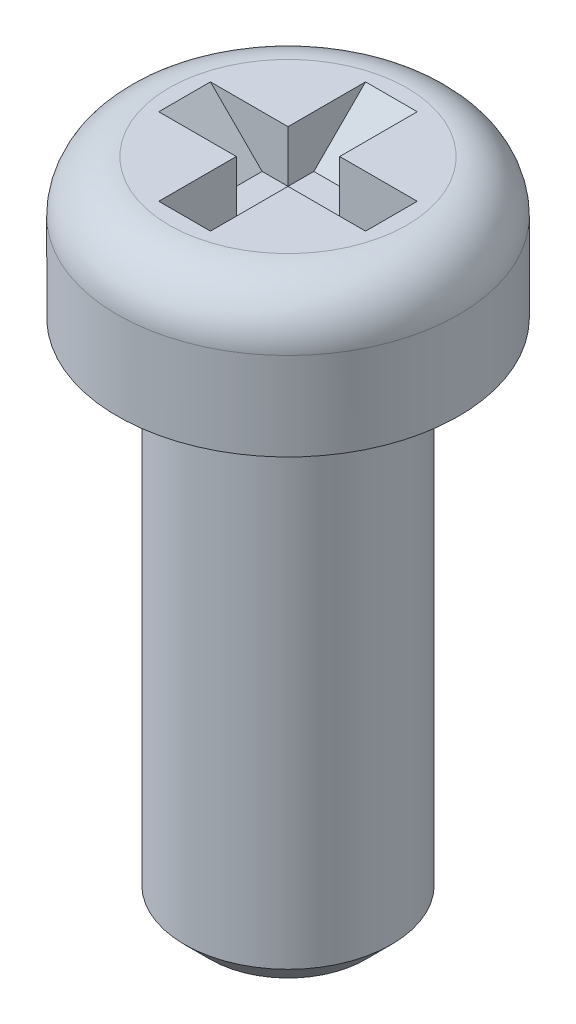
ISO-10303-21;
HEADER;
FILE_DESCRIPTION(('STEP AP214'),'2;1');
FILE_NAME('part.step','',(''),(''),'','','');
FILE_SCHEMA(('AUTOMOTIVE_DESIGN { 1 0 10303 214 1 1 1 1 }'));
ENDSEC;
DATA;
#1=APPLICATION_CONTEXT('core data for automotive mechanical design processes');
#2=APPLICATION_PROTOCOL_DEFINITION('international standard','automotive_design',2000,#1);
#3=PRODUCT_CONTEXT('',#1,'mechanical');
#4=PRODUCT('Part','Part','',(#3));
#5=PRODUCT_RELATED_PRODUCT_CATEGORY('part','',(#4));
#6=PRODUCT_DEFINITION_FORMATION('','',#4);
#7=PRODUCT_DEFINITION_CONTEXT('part definition',#1,'design');
#8=PRODUCT_DEFINITION('design','',#6,#7);
#9=PRODUCT_DEFINITION_SHAPE('','',#8);
#10=(LENGTH_UNIT() NAMED_UNIT(*) SI_UNIT(.MILLI.,.METRE.));
#11=(NAMED_UNIT(*) PLANE_ANGLE_UNIT() SI_UNIT($,.RADIAN.));
#12=(NAMED_UNIT(*) SI_UNIT($,.STERADIAN.) SOLID_ANGLE_UNIT());
#13=UNCERTAINTY_MEASURE_WITH_UNIT(LENGTH_MEASURE(1.E-05),#10,'distance_accuracy_value','');
#14=(GEOMETRIC_REPRESENTATION_CONTEXT(3) GLOBAL_UNCERTAINTY_ASSIGNED_CONTEXT((#13)) GLOBAL_UNIT_ASSIGNED_CONTEXT((#10,
#11,#12)) REPRESENTATION_CONTEXT('',''));
#15=CARTESIAN_POINT('',(0.,0.,0.));
#16=DIRECTION('',(0.,0.,1.));
#17=DIRECTION('',(1.,0.,0.));
#18=AXIS2_PLACEMENT_3D('',#15,#16,#17);
#19=CARTESIAN_POINT('',(0.,10.,0.));
#20=DIRECTION('',(0.,-1.,0.));
#21=DIRECTION('',(0.,0.,-1.));
#22=AXIS2_PLACEMENT_3D('',#19,#20,#21);
#23=CYLINDRICAL_SURFACE('',#22,2.);
#24=CARTESIAN_POINT('',(0.,0.5,0.));
#25=DIRECTION('',(0.,1.,0.));
#26=DIRECTION('',(0.,0.,1.));
#27=AXIS2_PLACEMENT_3D('',#24,#25,#26);
#28=CIRCLE('',#27,2.);
#29=CARTESIAN_POINT('',(0.,0.5,2.));
#30=VERTEX_POINT('',#29);
#31=EDGE_CURVE('E245',#30,#30,#28,.T.);
#32=ORIENTED_EDGE('',*,*,#31,.T.);
#33=EDGE_LOOP('',(#32));
#34=FACE_BOUND('',#33,.T.);
#35=CARTESIAN_POINT('',(0.,10.,0.));
#36=DIRECTION('',(0.,1.,0.));
#37=DIRECTION('',(0.,0.,1.));
#38=AXIS2_PLACEMENT_3D('',#35,#36,#37);
#39=CIRCLE('',#38,2.);
#40=CARTESIAN_POINT('',(0.,10.,2.));
#41=VERTEX_POINT('',#40);
#42=EDGE_CURVE('E231',#41,#41,#39,.T.);
#43=ORIENTED_EDGE('',*,*,#42,.F.);
#44=EDGE_LOOP('',(#43));
#45=FACE_BOUND('',#44,.T.);
#46=ADVANCED_FACE('F70',(#34,#45),#23,.T.);
#47=CARTESIAN_POINT('',(0.,0.,0.));
#48=DIRECTION('',(0.,1.,0.));
#49=DIRECTION('',(0.,0.,1.));
#50=AXIS2_PLACEMENT_3D('',#47,#48,#49);
#51=PLANE('',#50);
#52=CARTESIAN_POINT('',(0.,0.,0.));
#53=DIRECTION('',(0.,1.,0.));
#54=DIRECTION('',(0.,0.,1.));
#55=AXIS2_PLACEMENT_3D('',#52,#53,#54);
#56=CIRCLE('',#55,1.5);
#57=CARTESIAN_POINT('',(0.,0.,1.5));
#58=VERTEX_POINT('',#57);
#59=EDGE_CURVE('E244',#58,#58,#56,.F.);
#60=ORIENTED_EDGE('',*,*,#59,.T.);
#61=EDGE_LOOP('',(#60));
#62=FACE_BOUND('',#61,.T.);
#63=ADVANCED_FACE('F309',(#62),#51,.F.);
#64=CARTESIAN_POINT('',(0.,12.7,0.));
#65=DIRECTION('',(0.,-1.,0.));
#66=DIRECTION('',(0.,0.,-1.));
#67=AXIS2_PLACEMENT_3D('',#64,#65,#66);
#68=CYLINDRICAL_SURFACE('',#67,3.3);
#69=CARTESIAN_POINT('',(0.,11.7,0.));
#70=DIRECTION('',(0.,1.,0.));
#71=DIRECTION('',(0.,0.,1.));
#72=AXIS2_PLACEMENT_3D('',#69,#70,#71);
#73=CIRCLE('',#72,3.3);
#74=CARTESIAN_POINT('',(0.,11.7,-3.3));
#75=VERTEX_POINT('',#74);
#76=EDGE_CURVE('E237',#75,#75,#73,.F.);
#77=CARTESIAN_POINT('',(0.,10.,0.));
#78=DIRECTION('',(0.,1.,0.));
#79=DIRECTION('',(0.,0.,1.));
#80=AXIS2_PLACEMENT_3D('',#77,#78,#79);
#81=CIRCLE('',#80,3.3);
#82=CARTESIAN_POINT('',(0.,10.,-3.3));
#83=VERTEX_POINT('',#82);
#84=EDGE_CURVE('E217',#83,#83,#81,.T.);
#85=CARTESIAN_POINT('',(0.,11.7,-3.3));
#86=CARTESIAN_POINT('',(0.,11.6822916666667,-3.3));
#87=CARTESIAN_POINT('',(0.,11.6645833333333,-3.3));
#88=CARTESIAN_POINT('',(0.,11.6291666666667,-3.3));
#89=CARTESIAN_POINT('',(0.,11.6114583333333,-3.3));
#90=CARTESIAN_POINT('',(0.,11.5760416666667,-3.3));
#91=CARTESIAN_POINT('',(0.,11.5583333333333,-3.3));
#92=CARTESIAN_POINT('',(0.,11.5229166666667,-3.3));
#93=CARTESIAN_POINT('',(0.,11.5052083333333,-3.3));
#94=CARTESIAN_POINT('',(0.,11.4697916666667,-3.3));
#95=CARTESIAN_POINT('',(0.,11.4520833333333,-3.3));
#96=CARTESIAN_POINT('',(0.,11.4166666666667,-3.3));
#97=CARTESIAN_POINT('',(0.,11.3989583333333,-3.3));
#98=CARTESIAN_POINT('',(0.,11.3635416666667,-3.3));
#99=CARTESIAN_POINT('',(0.,11.3458333333333,-3.3));
#100=CARTESIAN_POINT('',(0.,11.3104166666667,-3.3));
#101=CARTESIAN_POINT('',(0.,11.2927083333333,-3.3));
#102=CARTESIAN_POINT('',(0.,11.2572916666667,-3.3));
#103=CARTESIAN_POINT('',(0.,11.2395833333333,-3.3));
#104=CARTESIAN_POINT('',(0.,11.2041666666667,-3.3));
#105=CARTESIAN_POINT('',(0.,11.1864583333333,-3.3));
#106=CARTESIAN_POINT('',(0.,11.1510416666667,-3.3));
#107=CARTESIAN_POINT('',(0.,11.1333333333333,-3.3));
#108=CARTESIAN_POINT('',(0.,11.0979166666667,-3.3));
#109=CARTESIAN_POINT('',(0.,11.0802083333333,-3.3));
#110=CARTESIAN_POINT('',(0.,11.0447916666667,-3.3));
#111=CARTESIAN_POINT('',(0.,11.0270833333333,-3.3));
#112=CARTESIAN_POINT('',(0.,10.9916666666667,-3.3));
#113=CARTESIAN_POINT('',(0.,10.9739583333333,-3.3));
#114=CARTESIAN_POINT('',(0.,10.9385416666667,-3.3));
#115=CARTESIAN_POINT('',(0.,10.9208333333333,-3.3));
#116=CARTESIAN_POINT('',(0.,10.8854166666667,-3.3));
#117=CARTESIAN_POINT('',(0.,10.8677083333333,-3.3));
#118=CARTESIAN_POINT('',(0.,10.8322916666667,-3.3));
#119=CARTESIAN_POINT('',(0.,10.8145833333333,-3.3));
#120=CARTESIAN_POINT('',(0.,10.7791666666667,-3.3));
#121=CARTESIAN_POINT('',(0.,10.7614583333333,-3.3));
#122=CARTESIAN_POINT('',(0.,10.7260416666667,-3.3));
#123=CARTESIAN_POINT('',(0.,10.7083333333333,-3.3));
#124=CARTESIAN_POINT('',(0.,10.6729166666667,-3.3));
#125=CARTESIAN_POINT('',(0.,10.6552083333333,-3.3));
#126=CARTESIAN_POINT('',(0.,10.6197916666667,-3.3));
#127=CARTESIAN_POINT('',(0.,10.6020833333333,-3.3));
#128=CARTESIAN_POINT('',(0.,10.5666666666667,-3.3));
#129=CARTESIAN_POINT('',(0.,10.5489583333333,-3.3));
#130=CARTESIAN_POINT('',(0.,10.5135416666667,-3.3));
#131=CARTESIAN_POINT('',(0.,10.4958333333333,-3.3));
#132=CARTESIAN_POINT('',(0.,10.4604166666667,-3.3));
#133=CARTESIAN_POINT('',(0.,10.4427083333333,-3.3));
#134=CARTESIAN_POINT('',(0.,10.4072916666667,-3.3));
#135=CARTESIAN_POINT('',(0.,10.3895833333333,-3.3));
#136=CARTESIAN_POINT('',(0.,10.3541666666667,-3.3));
#137=CARTESIAN_POINT('',(0.,10.3364583333333,-3.3));
#138=CARTESIAN_POINT('',(0.,10.3010416666667,-3.3));
#139=CARTESIAN_POINT('',(0.,10.2833333333333,-3.3));
#140=CARTESIAN_POINT('',(0.,10.2479166666667,-3.3));
#141=CARTESIAN_POINT('',(0.,10.2302083333333,-3.3));
#142=CARTESIAN_POINT('',(0.,10.1947916666667,-3.3));
#143=CARTESIAN_POINT('',(0.,10.1770833333333,-3.3));
#144=CARTESIAN_POINT('',(0.,10.1416666666667,-3.3));
#145=CARTESIAN_POINT('',(0.,10.1239583333333,-3.3));
#146=CARTESIAN_POINT('',(0.,10.0885416666667,-3.3));
#147=CARTESIAN_POINT('',(0.,10.0708333333333,-3.3));
#148=CARTESIAN_POINT('',(0.,10.0354166666667,-3.3));
#149=CARTESIAN_POINT('',(0.,10.0177083333333,-3.3));
#150=CARTESIAN_POINT('',(0.,10.,-3.3));
#151=B_SPLINE_CURVE_WITH_KNOTS('',3,(#85,#86,#87,#88,#89,#90,#91,#92,#93,#94,#95,#96,#97,#98,
#99,#100,#101,#102,#103,#104,#105,#106,#107,#108,#109,#110,#111,#112,#113,#114,#115,#116,#117,
#118,#119,#120,#121,#122,#123,#124,#125,#126,#127,#128,#129,#130,#131,#132,#133,#134,#135,#136,
#137,#138,#139,#140,#141,#142,#143,#144,#145,#146,#147,#148,#149,#150),.UNSPECIFIED.,.F.,.F.,(4,
2,2,2,2,2,2,2,2,2,2,2,2,2,2,2,2,2,2,2,2,2,2,2,2,2,2,2,2,2,2,2,4),(0.,0.0531249999999994,
0.106249999999999,0.159375,0.212499999999999,0.265624999999999,0.31875,0.371874999999999,
0.424999999999998,0.478124999999999,0.531249999999999,0.584374999999998,0.637499999999999,
0.690624999999998,0.743749999999998,0.796874999999999,0.849999999999998,0.903124999999998,
0.956249999999997,1.009375,1.0625,1.115625,1.16875,1.221875,1.275,1.328125,1.38125,1.434375,
1.4875,1.540625,1.59375,1.646875,1.7),.UNSPECIFIED.);
#152=EDGE_CURVE('BSEAM317',#75,#83,#151,.T.);
#153=ORIENTED_EDGE('',*,*,#76,.T.);
#154=ORIENTED_EDGE('',*,*,#84,.T.);
#155=ORIENTED_EDGE('',*,*,#152,.T.);
#156=ORIENTED_EDGE('',*,*,#152,.F.);
#157=EDGE_LOOP('',(#153,#155,#154,#156));
#158=FACE_BOUND('',#157,.T.);
#159=ADVANCED_FACE('F317',(#158),#68,.T.);
#160=CARTESIAN_POINT('',(0.,12.7,0.));
#161=DIRECTION('',(0.,1.,0.));
#162=DIRECTION('',(0.,0.,1.));
#163=AXIS2_PLACEMENT_3D('',#160,#161,#162);
#164=PLANE('',#163);
#165=DIRECTION('',(0.,0.,-1.));
#166=VECTOR('',#165,1.);
#167=CARTESIAN_POINT('',(-0.5,12.7,-2.));
#168=LINE('',#167,#166);
#169=CARTESIAN_POINT('',(-0.5,12.7,-2.));
#170=VERTEX_POINT('',#169);
#171=CARTESIAN_POINT('',(-0.5,12.7,-0.5));
#172=VERTEX_POINT('',#171);
#173=EDGE_CURVE('E190',#170,#172,#168,.F.);
#174=ORIENTED_EDGE('',*,*,#173,.F.);
#175=DIRECTION('',(1.,0.,0.));
#176=VECTOR('',#175,1.);
#177=CARTESIAN_POINT('',(-0.5,12.7,-2.));
#178=LINE('',#177,#176);
#179=CARTESIAN_POINT('',(0.5,12.7,-2.));
#180=VERTEX_POINT('',#179);
#181=EDGE_CURVE('E193',#170,#180,#178,.T.);
#182=ORIENTED_EDGE('',*,*,#181,.T.);
#183=DIRECTION('',(0.,0.,-1.));
#184=VECTOR('',#183,1.);
#185=CARTESIAN_POINT('',(0.5,12.7,-2.));
#186=LINE('',#185,#184);
#187=CARTESIAN_POINT('',(0.5,12.7,-0.5));
#188=VERTEX_POINT('',#187);
#189=EDGE_CURVE('E185',#180,#188,#186,.F.);
#190=ORIENTED_EDGE('',*,*,#189,.T.);
#191=DIRECTION('',(1.,0.,0.));
#192=VECTOR('',#191,1.);
#193=CARTESIAN_POINT('',(-2.,12.7,-0.5));
#194=LINE('',#193,#192);
#195=CARTESIAN_POINT('',(2.,12.7,-0.500000000000001));
#196=VERTEX_POINT('',#195);
#197=EDGE_CURVE('E221',#188,#196,#194,.T.);
#198=ORIENTED_EDGE('',*,*,#197,.T.);
#199=DIRECTION('',(0.,0.,1.));
#200=VECTOR('',#199,1.);
#201=CARTESIAN_POINT('',(2.,12.7,-0.500000000000001));
#202=LINE('',#201,#200);
#203=CARTESIAN_POINT('',(2.,12.7,0.499999999999999));
#204=VERTEX_POINT('',#203);
#205=EDGE_CURVE('E225',#196,#204,#202,.T.);
#206=ORIENTED_EDGE('',*,*,#205,.T.);
#207=DIRECTION('',(1.,0.,0.));
#208=VECTOR('',#207,1.);
#209=CARTESIAN_POINT('',(-2.,12.7,0.5));
#210=LINE('',#209,#208);
#211=CARTESIAN_POINT('',(0.5,12.7,0.5));
#212=VERTEX_POINT('',#211);
#213=EDGE_CURVE('E181',#212,#204,#210,.T.);
#214=ORIENTED_EDGE('',*,*,#213,.F.);
#215=CARTESIAN_POINT('',(0.5,12.7,2.));
#216=VERTEX_POINT('',#215);
#217=EDGE_CURVE('E162',#212,#216,#186,.F.);
#218=ORIENTED_EDGE('',*,*,#217,.T.);
#219=DIRECTION('',(-1.,0.,0.));
#220=VECTOR('',#219,1.);
#221=CARTESIAN_POINT('',(0.5,12.7,2.));
#222=LINE('',#221,#220);
#223=CARTESIAN_POINT('',(-0.5,12.7,2.));
#224=VERTEX_POINT('',#223);
#225=EDGE_CURVE('E178',#216,#224,#222,.T.);
#226=ORIENTED_EDGE('',*,*,#225,.T.);
#227=CARTESIAN_POINT('',(-0.5,12.7,0.5));
#228=VERTEX_POINT('',#227);
#229=EDGE_CURVE('E188',#228,#224,#168,.F.);
#230=ORIENTED_EDGE('',*,*,#229,.F.);
#231=CARTESIAN_POINT('',(-2.,12.7,0.5));
#232=VERTEX_POINT('',#231);
#233=EDGE_CURVE('E220',#232,#228,#210,.T.);
#234=ORIENTED_EDGE('',*,*,#233,.F.);
#235=DIRECTION('',(0.,0.,-1.));
#236=VECTOR('',#235,1.);
#237=CARTESIAN_POINT('',(-2.,12.7,0.5));
#238=LINE('',#237,#236);
#239=CARTESIAN_POINT('',(-2.,12.7,-0.5));
#240=VERTEX_POINT('',#239);
#241=EDGE_CURVE('E226',#232,#240,#238,.T.);
#242=ORIENTED_EDGE('',*,*,#241,.T.);
#243=EDGE_CURVE('E223',#240,#172,#194,.T.);
#244=ORIENTED_EDGE('',*,*,#243,.T.);
#245=EDGE_LOOP('',(#174,#182,#190,#198,#206,#214,#218,#226,#230,#234,#242,#244));
#246=FACE_BOUND('',#245,.T.);
#247=CARTESIAN_POINT('',(0.,12.7,0.));
#248=DIRECTION('',(0.,1.,0.));
#249=DIRECTION('',(0.,0.,1.));
#250=AXIS2_PLACEMENT_3D('',#247,#248,#249);
#251=CIRCLE('',#250,2.3);
#252=CARTESIAN_POINT('',(0.,12.7,2.3));
#253=VERTEX_POINT('',#252);
#254=EDGE_CURVE('E236',#253,#253,#251,.T.);
#255=ORIENTED_EDGE('',*,*,#254,.T.);
#256=EDGE_LOOP('',(#255));
#257=FACE_BOUND('',#256,.T.);
#258=ADVANCED_FACE('F174',(#246,#257),#164,.T.);
#259=CARTESIAN_POINT('',(0.,10.,0.));
#260=DIRECTION('',(0.,1.,0.));
#261=DIRECTION('',(0.,0.,1.));
#262=AXIS2_PLACEMENT_3D('',#259,#260,#261);
#263=PLANE('',#262);
#264=ORIENTED_EDGE('',*,*,#42,.T.);
#265=EDGE_LOOP('',(#264));
#266=FACE_BOUND('',#265,.T.);
#267=ORIENTED_EDGE('',*,*,#84,.F.);
#268=EDGE_LOOP('',(#267));
#269=FACE_BOUND('',#268,.T.);
#270=ADVANCED_FACE('F324',(#266,#269),#263,.F.);
#271=CARTESIAN_POINT('',(0.,11.7,0.));
#272=DIRECTION('',(0.,1.,0.));
#273=DIRECTION('',(0.,0.,1.));
#274=AXIS2_PLACEMENT_3D('',#271,#272,#273);
#275=TOROIDAL_SURFACE('',#274,2.3,1.);
#276=ORIENTED_EDGE('',*,*,#76,.F.);
#277=EDGE_LOOP('',(#276));
#278=FACE_BOUND('',#277,.T.);
#279=ORIENTED_EDGE('',*,*,#254,.F.);
#280=EDGE_LOOP('',(#279));
#281=FACE_BOUND('',#280,.T.);
#282=ADVANCED_FACE('F302',(#278,#281),#275,.T.);
#283=CARTESIAN_POINT('',(0.,0.5,0.));
#284=DIRECTION('',(0.,1.,0.));
#285=DIRECTION('',(0.,0.,1.));
#286=AXIS2_PLACEMENT_3D('',#283,#284,#285);
#287=CONICAL_SURFACE('',#286,2.,0.78539816339745);
#288=ORIENTED_EDGE('',*,*,#59,.F.);
#289=EDGE_LOOP('',(#288));
#290=FACE_BOUND('',#289,.T.);
#291=ORIENTED_EDGE('',*,*,#31,.F.);
#292=EDGE_LOOP('',(#291));
#293=FACE_BOUND('',#292,.T.);
#294=ADVANCED_FACE('F298',(#290,#293),#287,.T.);
#295=CARTESIAN_POINT('',(-2.,11.7,0.5));
#296=DIRECTION('',(0.,0.,1.));
#297=DIRECTION('',(1.,0.,0.));
#298=AXIS2_PLACEMENT_3D('',#295,#296,#297);
#299=PLANE('',#298);
#300=ORIENTED_EDGE('',*,*,#213,.T.);
#301=DIRECTION('',(-0.707106781186544,-0.707106781186551,0.));
#302=VECTOR('',#301,1.);
#303=CARTESIAN_POINT('',(2.,12.7,0.499999999999999));
#304=LINE('',#303,#302);
#305=CARTESIAN_POINT('',(1.,11.7,0.5));
#306=VERTEX_POINT('',#305);
#307=EDGE_CURVE('E166',#204,#306,#304,.T.);
#308=ORIENTED_EDGE('',*,*,#307,.T.);
#309=DIRECTION('',(1.,0.,0.));
#310=VECTOR('',#309,1.);
#311=CARTESIAN_POINT('',(-2.,11.7,0.5));
#312=LINE('',#311,#310);
#313=CARTESIAN_POINT('',(0.5,11.7,0.5));
#314=VERTEX_POINT('',#313);
#315=EDGE_CURVE('E211',#314,#306,#312,.T.);
#316=ORIENTED_EDGE('',*,*,#315,.F.);
#317=DIRECTION('',(0.,-1.,0.));
#318=VECTOR('',#317,1.);
#319=CARTESIAN_POINT('',(0.5,11.7,0.5));
#320=LINE('',#319,#318);
#321=EDGE_CURVE('E205',#212,#314,#320,.T.);
#322=ORIENTED_EDGE('',*,*,#321,.F.);
#323=EDGE_LOOP('',(#300,#308,#316,#322));
#324=FACE_BOUND('',#323,.T.);
#325=ADVANCED_FACE('F295',(#324),#299,.F.);
#326=CARTESIAN_POINT('',(-2.,11.7,-0.5));
#327=DIRECTION('',(0.,0.,1.));
#328=DIRECTION('',(1.,0.,0.));
#329=AXIS2_PLACEMENT_3D('',#326,#327,#328);
#330=PLANE('',#329);
#331=DIRECTION('',(1.,0.,0.));
#332=VECTOR('',#331,1.);
#333=CARTESIAN_POINT('',(-2.,11.7,-0.5));
#334=LINE('',#333,#332);
#335=CARTESIAN_POINT('',(0.5,11.7,-0.5));
#336=VERTEX_POINT('',#335);
#337=CARTESIAN_POINT('',(1.,11.7,-0.5));
#338=VERTEX_POINT('',#337);
#339=EDGE_CURVE('E214',#336,#338,#334,.T.);
#340=ORIENTED_EDGE('',*,*,#339,.T.);
#341=DIRECTION('',(0.707106781186544,0.707106781186551,0.));
#342=VECTOR('',#341,1.);
#343=CARTESIAN_POINT('',(-0.499999999999984,10.2,-0.5));
#344=LINE('',#343,#342);
#345=EDGE_CURVE('E257',#338,#196,#344,.T.);
#346=ORIENTED_EDGE('',*,*,#345,.T.);
#347=ORIENTED_EDGE('',*,*,#197,.F.);
#348=DIRECTION('',(0.,-1.,0.));
#349=VECTOR('',#348,1.);
#350=CARTESIAN_POINT('',(0.5,11.7,-0.5));
#351=LINE('',#350,#349);
#352=EDGE_CURVE('E200',#188,#336,#351,.T.);
#353=ORIENTED_EDGE('',*,*,#352,.T.);
#354=EDGE_LOOP('',(#340,#346,#347,#353));
#355=FACE_BOUND('',#354,.T.);
#356=ADVANCED_FACE('F290',(#355),#330,.T.);
#357=CARTESIAN_POINT('',(-1.,11.7,0.5));
#358=VERTEX_POINT('',#357);
#359=CARTESIAN_POINT('',(-0.5,11.7,0.5));
#360=VERTEX_POINT('',#359);
#361=EDGE_CURVE('E212',#358,#360,#312,.T.);
#362=ORIENTED_EDGE('',*,*,#361,.F.);
#363=DIRECTION('',(-0.707106781186544,0.707106781186551,0.));
#364=VECTOR('',#363,1.);
#365=CARTESIAN_POINT('',(-2.,12.7,0.5));
#366=LINE('',#365,#364);
#367=EDGE_CURVE('E12',#358,#232,#366,.T.);
#368=ORIENTED_EDGE('',*,*,#367,.T.);
#369=ORIENTED_EDGE('',*,*,#233,.T.);
#370=DIRECTION('',(0.,-1.,0.));
#371=VECTOR('',#370,1.);
#372=CARTESIAN_POINT('',(-0.5,11.7,0.5));
#373=LINE('',#372,#371);
#374=EDGE_CURVE('E206',#228,#360,#373,.T.);
#375=ORIENTED_EDGE('',*,*,#374,.T.);
#376=EDGE_LOOP('',(#362,#368,#369,#375));
#377=FACE_BOUND('',#376,.T.);
#378=ADVANCED_FACE('F274',(#377),#299,.F.);
#379=ORIENTED_EDGE('',*,*,#243,.F.);
#380=DIRECTION('',(0.707106781186544,-0.707106781186551,0.));
#381=VECTOR('',#380,1.);
#382=CARTESIAN_POINT('',(-1.5,12.2,-0.5));
#383=LINE('',#382,#381);
#384=CARTESIAN_POINT('',(-1.,11.7,-0.5));
#385=VERTEX_POINT('',#384);
#386=EDGE_CURVE('E76',#240,#385,#383,.T.);
#387=ORIENTED_EDGE('',*,*,#386,.T.);
#388=CARTESIAN_POINT('',(-0.5,11.7,-0.5));
#389=VERTEX_POINT('',#388);
#390=EDGE_CURVE('E213',#385,#389,#334,.T.);
#391=ORIENTED_EDGE('',*,*,#390,.T.);
#392=DIRECTION('',(0.,-1.,0.));
#393=VECTOR('',#392,1.);
#394=CARTESIAN_POINT('',(-0.5,11.7,-0.5));
#395=LINE('',#394,#393);
#396=EDGE_CURVE('E203',#172,#389,#395,.T.);
#397=ORIENTED_EDGE('',*,*,#396,.F.);
#398=EDGE_LOOP('',(#379,#387,#391,#397));
#399=FACE_BOUND('',#398,.T.);
#400=ADVANCED_FACE('F262',(#399),#330,.T.);
#401=CARTESIAN_POINT('',(0.,11.7,0.));
#402=DIRECTION('',(0.,-1.,0.));
#403=DIRECTION('',(-1.,0.,0.));
#404=AXIS2_PLACEMENT_3D('',#401,#402,#403);
#405=PLANE('',#404);
#406=DIRECTION('',(0.,0.,-1.));
#407=VECTOR('',#406,1.);
#408=CARTESIAN_POINT('',(-0.5,11.7,-2.));
#409=LINE('',#408,#407);
#410=CARTESIAN_POINT('',(-0.5,11.7,1.));
#411=VERTEX_POINT('',#410);
#412=EDGE_CURVE('E197',#360,#411,#409,.F.);
#413=ORIENTED_EDGE('',*,*,#412,.T.);
#414=DIRECTION('',(1.,0.,0.));
#415=VECTOR('',#414,1.);
#416=CARTESIAN_POINT('',(0.,11.7,1.));
#417=LINE('',#416,#415);
#418=CARTESIAN_POINT('',(0.5,11.7,1.));
#419=VERTEX_POINT('',#418);
#420=EDGE_CURVE('E169',#411,#419,#417,.T.);
#421=ORIENTED_EDGE('',*,*,#420,.T.);
#422=DIRECTION('',(0.,0.,-1.));
#423=VECTOR('',#422,1.);
#424=CARTESIAN_POINT('',(0.5,11.7,-2.));
#425=LINE('',#424,#423);
#426=EDGE_CURVE('E165',#314,#419,#425,.F.);
#427=ORIENTED_EDGE('',*,*,#426,.F.);
#428=ORIENTED_EDGE('',*,*,#315,.T.);
#429=DIRECTION('',(0.,0.,-1.));
#430=VECTOR('',#429,1.);
#431=CARTESIAN_POINT('',(1.,11.7,0.));
#432=LINE('',#431,#430);
#433=EDGE_CURVE('E255',#306,#338,#432,.T.);
#434=ORIENTED_EDGE('',*,*,#433,.T.);
#435=ORIENTED_EDGE('',*,*,#339,.F.);
#436=CARTESIAN_POINT('',(0.5,11.7,-1.));
#437=VERTEX_POINT('',#436);
#438=EDGE_CURVE('E204',#437,#336,#425,.F.);
#439=ORIENTED_EDGE('',*,*,#438,.F.);
#440=DIRECTION('',(-1.,0.,0.));
#441=VECTOR('',#440,1.);
#442=CARTESIAN_POINT('',(0.,11.7,-1.));
#443=LINE('',#442,#441);
#444=CARTESIAN_POINT('',(-0.5,11.7,-1.));
#445=VERTEX_POINT('',#444);
#446=EDGE_CURVE('E83',#437,#445,#443,.T.);
#447=ORIENTED_EDGE('',*,*,#446,.T.);
#448=EDGE_CURVE('E268',#445,#389,#409,.F.);
#449=ORIENTED_EDGE('',*,*,#448,.T.);
#450=ORIENTED_EDGE('',*,*,#390,.F.);
#451=DIRECTION('',(0.,0.,1.));
#452=VECTOR('',#451,1.);
#453=CARTESIAN_POINT('',(-1.,11.7,0.));
#454=LINE('',#453,#452);
#455=EDGE_CURVE('E248',#385,#358,#454,.T.);
#456=ORIENTED_EDGE('',*,*,#455,.T.);
#457=ORIENTED_EDGE('',*,*,#361,.T.);
#458=EDGE_LOOP('',(#413,#421,#427,#428,#434,#435,#439,#447,#449,#450,#456,#457));
#459=FACE_BOUND('',#458,.T.);
#460=ADVANCED_FACE('F269',(#459),#405,.F.);
#461=CARTESIAN_POINT('',(0.5,11.7,-2.));
#462=DIRECTION('',(-1.,0.,0.));
#463=DIRECTION('',(0.,0.,1.));
#464=AXIS2_PLACEMENT_3D('',#461,#462,#463);
#465=PLANE('',#464);
#466=ORIENTED_EDGE('',*,*,#189,.F.);
#467=DIRECTION('',(0.,-0.707106781186551,0.707106781186544));
#468=VECTOR('',#467,1.);
#469=CARTESIAN_POINT('',(0.5,12.2,-1.5));
#470=LINE('',#469,#468);
#471=EDGE_CURVE('E94',#180,#437,#470,.T.);
#472=ORIENTED_EDGE('',*,*,#471,.T.);
#473=ORIENTED_EDGE('',*,*,#438,.T.);
#474=ORIENTED_EDGE('',*,*,#352,.F.);
#475=EDGE_LOOP('',(#466,#472,#473,#474));
#476=FACE_BOUND('',#475,.T.);
#477=ADVANCED_FACE('F283',(#476),#465,.T.);
#478=CARTESIAN_POINT('',(-0.5,11.7,-2.));
#479=DIRECTION('',(-1.,0.,0.));
#480=DIRECTION('',(0.,0.,1.));
#481=AXIS2_PLACEMENT_3D('',#478,#479,#480);
#482=PLANE('',#481);
#483=ORIENTED_EDGE('',*,*,#448,.F.);
#484=DIRECTION('',(0.,0.707106781186551,-0.707106781186544));
#485=VECTOR('',#484,1.);
#486=CARTESIAN_POINT('',(-0.5,12.7,-2.));
#487=LINE('',#486,#485);
#488=EDGE_CURVE('E256',#445,#170,#487,.T.);
#489=ORIENTED_EDGE('',*,*,#488,.T.);
#490=ORIENTED_EDGE('',*,*,#173,.T.);
#491=ORIENTED_EDGE('',*,*,#396,.T.);
#492=EDGE_LOOP('',(#483,#489,#490,#491));
#493=FACE_BOUND('',#492,.T.);
#494=ADVANCED_FACE('F346',(#493),#482,.F.);
#495=ORIENTED_EDGE('',*,*,#229,.T.);
#496=DIRECTION('',(0.,-0.707106781186551,-0.707106781186544));
#497=VECTOR('',#496,1.);
#498=CARTESIAN_POINT('',(-0.5,12.7,2.));
#499=LINE('',#498,#497);
#500=EDGE_CURVE('E184',#224,#411,#499,.T.);
#501=ORIENTED_EDGE('',*,*,#500,.T.);
#502=ORIENTED_EDGE('',*,*,#412,.F.);
#503=ORIENTED_EDGE('',*,*,#374,.F.);
#504=EDGE_LOOP('',(#495,#501,#502,#503));
#505=FACE_BOUND('',#504,.T.);
#506=ADVANCED_FACE('F277',(#505),#482,.F.);
#507=ORIENTED_EDGE('',*,*,#426,.T.);
#508=DIRECTION('',(0.,0.707106781186551,0.707106781186544));
#509=VECTOR('',#508,1.);
#510=CARTESIAN_POINT('',(0.5,10.2,-0.499999999999984));
#511=LINE('',#510,#509);
#512=EDGE_CURVE('E159',#419,#216,#511,.T.);
#513=ORIENTED_EDGE('',*,*,#512,.T.);
#514=ORIENTED_EDGE('',*,*,#217,.F.);
#515=ORIENTED_EDGE('',*,*,#321,.T.);
#516=EDGE_LOOP('',(#507,#513,#514,#515));
#517=FACE_BOUND('',#516,.T.);
#518=ADVANCED_FACE('F158',(#517),#465,.T.);
#519=CARTESIAN_POINT('',(0.5,12.7,2.));
#520=DIRECTION('',(0.,-0.707106781186544,0.707106781186551));
#521=DIRECTION('',(-1.,0.,0.));
#522=AXIS2_PLACEMENT_3D('',#519,#520,#521);
#523=PLANE('',#522);
#524=ORIENTED_EDGE('',*,*,#512,.F.);
#525=ORIENTED_EDGE('',*,*,#420,.F.);
#526=ORIENTED_EDGE('',*,*,#500,.F.);
#527=ORIENTED_EDGE('',*,*,#225,.F.);
#528=EDGE_LOOP('',(#524,#525,#526,#527));
#529=FACE_BOUND('',#528,.T.);
#530=ADVANCED_FACE('F183',(#529),#523,.F.);
#531=CARTESIAN_POINT('',(2.,12.7,-0.500000000000001));
#532=DIRECTION('',(0.707106781186551,-0.707106781186544,0.));
#533=DIRECTION('',(0.,0.,1.));
#534=AXIS2_PLACEMENT_3D('',#531,#532,#533);
#535=PLANE('',#534);
#536=ORIENTED_EDGE('',*,*,#345,.F.);
#537=ORIENTED_EDGE('',*,*,#433,.F.);
#538=ORIENTED_EDGE('',*,*,#307,.F.);
#539=ORIENTED_EDGE('',*,*,#205,.F.);
#540=EDGE_LOOP('',(#536,#537,#538,#539));
#541=FACE_BOUND('',#540,.T.);
#542=ADVANCED_FACE('F293',(#541),#535,.F.);
#543=CARTESIAN_POINT('',(-0.5,12.7,-2.));
#544=DIRECTION('',(0.,-0.707106781186544,-0.707106781186551));
#545=DIRECTION('',(1.,0.,0.));
#546=AXIS2_PLACEMENT_3D('',#543,#544,#545);
#547=PLANE('',#546);
#548=ORIENTED_EDGE('',*,*,#488,.F.);
#549=ORIENTED_EDGE('',*,*,#446,.F.);
#550=ORIENTED_EDGE('',*,*,#471,.F.);
#551=ORIENTED_EDGE('',*,*,#181,.F.);
#552=EDGE_LOOP('',(#548,#549,#550,#551));
#553=FACE_BOUND('',#552,.T.);
#554=ADVANCED_FACE('F339',(#553),#547,.F.);
#555=CARTESIAN_POINT('',(-2.,12.7,0.5));
#556=DIRECTION('',(-0.707106781186551,-0.707106781186544,0.));
#557=DIRECTION('',(0.,0.,-1.));
#558=AXIS2_PLACEMENT_3D('',#555,#556,#557);
#559=PLANE('',#558);
#560=ORIENTED_EDGE('',*,*,#367,.F.);
#561=ORIENTED_EDGE('',*,*,#455,.F.);
#562=ORIENTED_EDGE('',*,*,#386,.F.);
#563=ORIENTED_EDGE('',*,*,#241,.F.);
#564=EDGE_LOOP('',(#560,#561,#562,#563));
#565=FACE_BOUND('',#564,.T.);
#566=ADVANCED_FACE('F75',(#565),#559,.F.);
#567=CLOSED_SHELL('',(#46,#63,#159,#258,#270,#282,#294,#325,#356,#378,#400,#460,#477,#494,#506,
#518,#530,#542,#554,#566));
#568=MANIFOLD_SOLID_BREP('B2',#567);
#569=ADVANCED_BREP_SHAPE_REPRESENTATION('',(#18,#568),#14);
#570=SHAPE_DEFINITION_REPRESENTATION(#9,#569);
ENDSEC;
END-ISO-10303-21;
